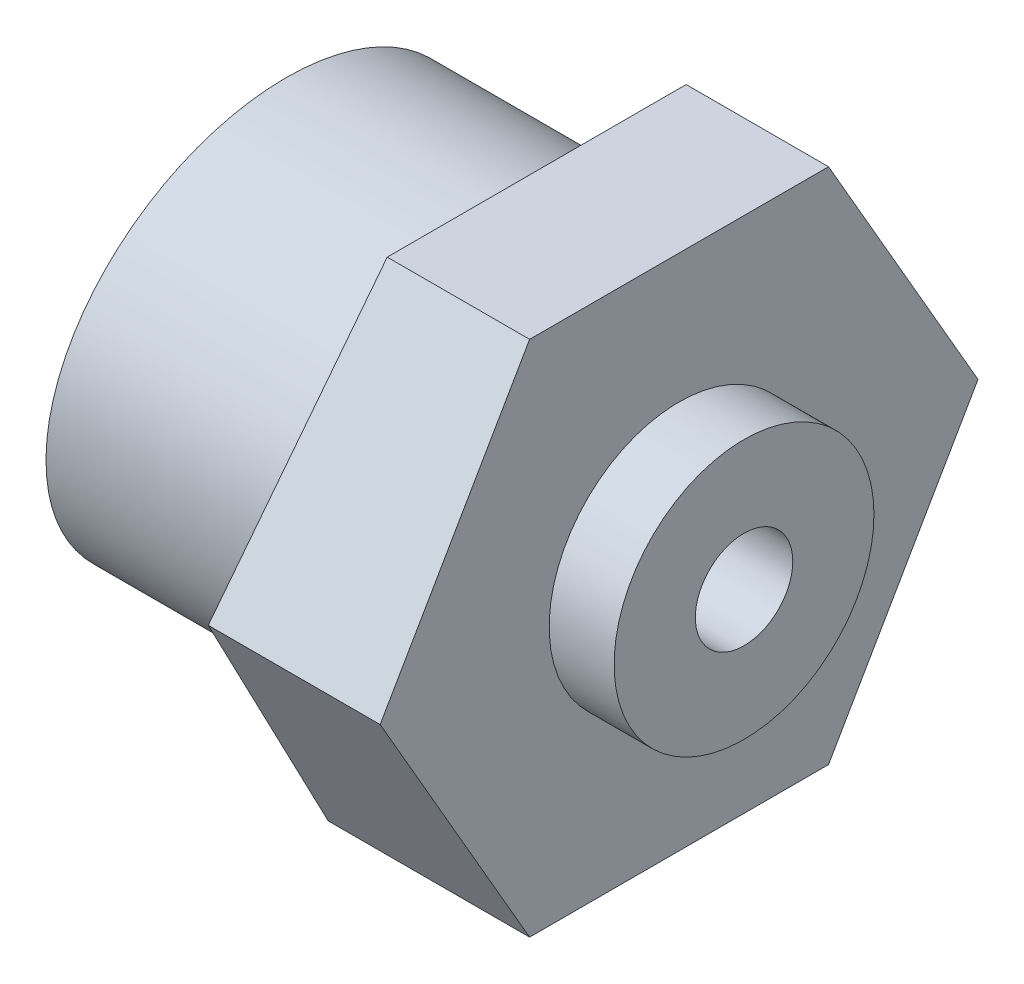
ISO-10303-21;
HEADER;
FILE_DESCRIPTION(('STEP AP214'),'2;1');
FILE_NAME('part.step','',(''),(''),'','','');
FILE_SCHEMA(('AUTOMOTIVE_DESIGN { 1 0 10303 214 1 1 1 1 }'));
ENDSEC;
DATA;
#1=APPLICATION_CONTEXT('core data for automotive mechanical design processes');
#2=APPLICATION_PROTOCOL_DEFINITION('international standard','automotive_design',2000,#1);
#3=PRODUCT_CONTEXT('',#1,'mechanical');
#4=PRODUCT('Part','Part','',(#3));
#5=PRODUCT_RELATED_PRODUCT_CATEGORY('part','',(#4));
#6=PRODUCT_DEFINITION_FORMATION('','',#4);
#7=PRODUCT_DEFINITION_CONTEXT('part definition',#1,'design');
#8=PRODUCT_DEFINITION('design','',#6,#7);
#9=PRODUCT_DEFINITION_SHAPE('','',#8);
#10=(LENGTH_UNIT() NAMED_UNIT(*) SI_UNIT(.MILLI.,.METRE.));
#11=(NAMED_UNIT(*) PLANE_ANGLE_UNIT() SI_UNIT($,.RADIAN.));
#12=(NAMED_UNIT(*) SI_UNIT($,.STERADIAN.) SOLID_ANGLE_UNIT());
#13=UNCERTAINTY_MEASURE_WITH_UNIT(LENGTH_MEASURE(1.E-05),#10,'distance_accuracy_value','');
#14=(GEOMETRIC_REPRESENTATION_CONTEXT(3) GLOBAL_UNCERTAINTY_ASSIGNED_CONTEXT((#13)) GLOBAL_UNIT_ASSIGNED_CONTEXT((#10,
#11,#12)) REPRESENTATION_CONTEXT('',''));
#15=CARTESIAN_POINT('',(0.,0.,0.));
#16=DIRECTION('',(0.,0.,1.));
#17=DIRECTION('',(1.,0.,0.));
#18=AXIS2_PLACEMENT_3D('',#15,#16,#17);
#19=CARTESIAN_POINT('',(-3.1,3.98499999999998,2.30074082272071));
#20=DIRECTION('',(0.,0.499999999999995,0.866025403784441));
#21=DIRECTION('',(0.,-0.866025403784441,0.499999999999995));
#22=AXIS2_PLACEMENT_3D('',#19,#20,#21);
#23=PLANE('',#22);
#24=DIRECTION('',(0.0981942796621983,0.861840131684073,-0.497583632026216));
#25=VECTOR('',#24,1.);
#26=CARTESIAN_POINT('',(-2.20068888774655,3.9081523310297,2.34510884508729));
#27=LINE('',#26,#25);
#28=CARTESIAN_POINT('',(-2.64596660091793,0.,4.60148164544132));
#29=VERTEX_POINT('',#28);
#30=CARTESIAN_POINT('',(-2.19193320183586,3.98499999999998,2.30074082272071));
#31=VERTEX_POINT('',#30);
#32=EDGE_CURVE('E124',#29,#31,#27,.T.);
#33=ORIENTED_EDGE('',*,*,#32,.F.);
#34=DIRECTION('',(1.,0.,0.));
#35=VECTOR('',#34,1.);
#36=CARTESIAN_POINT('',(-3.1,0.,4.60148164544132));
#37=LINE('',#36,#35);
#38=CARTESIAN_POINT('',(0.,0.,4.60148164544132));
#39=VERTEX_POINT('',#38);
#40=EDGE_CURVE('E108',#29,#39,#37,.T.);
#41=ORIENTED_EDGE('',*,*,#40,.T.);
#42=DIRECTION('',(0.,-0.866025403784441,0.499999999999995));
#43=VECTOR('',#42,1.);
#44=CARTESIAN_POINT('',(0.,3.98499999999998,2.30074082272071));
#45=LINE('',#44,#43);
#46=CARTESIAN_POINT('',(0.,3.98499999999998,2.30074082272071));
#47=VERTEX_POINT('',#46);
#48=EDGE_CURVE('E121',#47,#39,#45,.T.);
#49=ORIENTED_EDGE('',*,*,#48,.F.);
#50=DIRECTION('',(1.,0.,0.));
#51=VECTOR('',#50,1.);
#52=CARTESIAN_POINT('',(-3.1,3.98499999999998,2.30074082272071));
#53=LINE('',#52,#51);
#54=EDGE_CURVE('E48',#31,#47,#53,.T.);
#55=ORIENTED_EDGE('',*,*,#54,.F.);
#56=EDGE_LOOP('',(#33,#41,#49,#55));
#57=FACE_BOUND('',#56,.T.);
#58=ADVANCED_FACE('F39',(#57),#23,.T.);
#59=CARTESIAN_POINT('',(-3.1,3.98500000000002,-2.30074082272062));
#60=DIRECTION('',(0.,1.,0.));
#61=DIRECTION('',(0.,0.,1.));
#62=AXIS2_PLACEMENT_3D('',#59,#60,#61);
#63=PLANE('',#62);
#64=DIRECTION('',(0.,0.,1.));
#65=VECTOR('',#64,1.);
#66=CARTESIAN_POINT('',(-2.19193320183586,3.98499999999998,-16.5));
#67=LINE('',#66,#65);
#68=CARTESIAN_POINT('',(-2.19193320183586,3.98499999999997,-2.30074082272065));
#69=VERTEX_POINT('',#68);
#70=EDGE_CURVE('E150',#69,#31,#67,.T.);
#71=ORIENTED_EDGE('',*,*,#70,.T.);
#72=ORIENTED_EDGE('',*,*,#54,.T.);
#73=DIRECTION('',(0.,0.,1.));
#74=VECTOR('',#73,1.);
#75=CARTESIAN_POINT('',(0.,3.98500000000002,-2.30074082272062));
#76=LINE('',#75,#74);
#77=CARTESIAN_POINT('',(0.,3.98500000000002,-2.30074082272062));
#78=VERTEX_POINT('',#77);
#79=EDGE_CURVE('E97',#78,#47,#76,.T.);
#80=ORIENTED_EDGE('',*,*,#79,.F.);
#81=DIRECTION('',(1.,0.,0.));
#82=VECTOR('',#81,1.);
#83=CARTESIAN_POINT('',(-3.1,3.98500000000002,-2.30074082272062));
#84=LINE('',#83,#82);
#85=EDGE_CURVE('E80',#69,#78,#84,.T.);
#86=ORIENTED_EDGE('',*,*,#85,.F.);
#87=EDGE_LOOP('',(#71,#72,#80,#86));
#88=FACE_BOUND('',#87,.T.);
#89=ADVANCED_FACE('F102',(#88),#63,.T.);
#90=CARTESIAN_POINT('',(-3.1,0.,-4.60148164544132));
#91=DIRECTION('',(0.,0.500000000000007,-0.866025403784435));
#92=DIRECTION('',(0.,0.866025403784435,0.500000000000007));
#93=AXIS2_PLACEMENT_3D('',#90,#91,#92);
#94=PLANE('',#93);
#95=DIRECTION('',(-0.0981942796621976,-0.861840131684067,-0.497583632026228));
#96=VECTOR('',#95,1.);
#97=CARTESIAN_POINT('',(-2.65034444387327,-0.0384238344851046,-4.62366565662461));
#98=LINE('',#97,#96);
#99=CARTESIAN_POINT('',(-2.64596660091792,0.,-4.60148164544132));
#100=VERTEX_POINT('',#99);
#101=EDGE_CURVE('E87',#69,#100,#98,.T.);
#102=ORIENTED_EDGE('',*,*,#101,.F.);
#103=ORIENTED_EDGE('',*,*,#85,.T.);
#104=DIRECTION('',(0.,0.866025403784435,0.500000000000007));
#105=VECTOR('',#104,1.);
#106=CARTESIAN_POINT('',(0.,0.,-4.60148164544132));
#107=LINE('',#106,#105);
#108=CARTESIAN_POINT('',(0.,0.,-4.60148164544132));
#109=VERTEX_POINT('',#108);
#110=EDGE_CURVE('E84',#109,#78,#107,.T.);
#111=ORIENTED_EDGE('',*,*,#110,.F.);
#112=DIRECTION('',(1.,0.,0.));
#113=VECTOR('',#112,1.);
#114=CARTESIAN_POINT('',(-3.1,0.,-4.60148164544132));
#115=LINE('',#114,#113);
#116=EDGE_CURVE('E91',#100,#109,#115,.T.);
#117=ORIENTED_EDGE('',*,*,#116,.F.);
#118=EDGE_LOOP('',(#102,#103,#111,#117));
#119=FACE_BOUND('',#118,.T.);
#120=ADVANCED_FACE('F82',(#119),#94,.T.);
#121=CARTESIAN_POINT('',(-3.1,-3.98499999999999,-2.30074082272068));
#122=DIRECTION('',(0.,-0.499999999999995,-0.866025403784441));
#123=DIRECTION('',(0.,0.866025403784441,-0.499999999999995));
#124=AXIS2_PLACEMENT_3D('',#121,#122,#123);
#125=PLANE('',#124);
#126=DIRECTION('',(-0.0981942796621984,-0.861840131684074,0.497583632026216));
#127=VECTOR('',#126,1.);
#128=CARTESIAN_POINT('',(-3.1,-3.98499999999999,-2.30074082272068));
#129=LINE('',#128,#127);
#130=CARTESIAN_POINT('',(-3.1,-3.98499999999999,-2.30074082272068));
#131=VERTEX_POINT('',#130);
#132=EDGE_CURVE('E56',#100,#131,#129,.T.);
#133=ORIENTED_EDGE('',*,*,#132,.F.);
#134=ORIENTED_EDGE('',*,*,#116,.T.);
#135=DIRECTION('',(0.,0.866025403784441,-0.499999999999995));
#136=VECTOR('',#135,1.);
#137=CARTESIAN_POINT('',(0.,-3.98499999999999,-2.30074082272068));
#138=LINE('',#137,#136);
#139=CARTESIAN_POINT('',(0.,-3.98499999999999,-2.30074082272068));
#140=VERTEX_POINT('',#139);
#141=EDGE_CURVE('E100',#140,#109,#138,.T.);
#142=ORIENTED_EDGE('',*,*,#141,.F.);
#143=DIRECTION('',(1.,0.,0.));
#144=VECTOR('',#143,1.);
#145=CARTESIAN_POINT('',(-3.1,-3.98499999999999,-2.30074082272068));
#146=LINE('',#145,#144);
#147=EDGE_CURVE('E114',#131,#140,#146,.T.);
#148=ORIENTED_EDGE('',*,*,#147,.F.);
#149=EDGE_LOOP('',(#133,#134,#142,#148));
#150=FACE_BOUND('',#149,.T.);
#151=ADVANCED_FACE('F141',(#150),#125,.T.);
#152=CARTESIAN_POINT('',(-3.1,-3.98500000000001,2.30074082272065));
#153=DIRECTION('',(0.,-1.,0.));
#154=DIRECTION('',(0.,0.,-1.));
#155=AXIS2_PLACEMENT_3D('',#152,#153,#154);
#156=PLANE('',#155);
#157=DIRECTION('',(0.,0.,-1.));
#158=VECTOR('',#157,1.);
#159=CARTESIAN_POINT('',(0.,-3.98500000000001,2.30074082272065));
#160=LINE('',#159,#158);
#161=CARTESIAN_POINT('',(0.,-3.98500000000001,2.30074082272065));
#162=VERTEX_POINT('',#161);
#163=EDGE_CURVE('E132',#162,#140,#160,.T.);
#164=ORIENTED_EDGE('',*,*,#163,.F.);
#165=DIRECTION('',(1.,0.,0.));
#166=VECTOR('',#165,1.);
#167=CARTESIAN_POINT('',(-3.1,-3.98500000000001,2.30074082272065));
#168=LINE('',#167,#166);
#169=CARTESIAN_POINT('',(-3.1,-3.98500000000001,2.30074082272065));
#170=VERTEX_POINT('',#169);
#171=EDGE_CURVE('E116',#170,#162,#168,.T.);
#172=ORIENTED_EDGE('',*,*,#171,.F.);
#173=DIRECTION('',(0.,0.,-1.));
#174=VECTOR('',#173,1.);
#175=CARTESIAN_POINT('',(-3.1,-3.98500000000001,2.30074082272065));
#176=LINE('',#175,#174);
#177=EDGE_CURVE('E105',#170,#131,#176,.T.);
#178=ORIENTED_EDGE('',*,*,#177,.T.);
#179=ORIENTED_EDGE('',*,*,#147,.T.);
#180=EDGE_LOOP('',(#164,#172,#178,#179));
#181=FACE_BOUND('',#180,.T.);
#182=ADVANCED_FACE('F138',(#181),#156,.T.);
#183=CARTESIAN_POINT('',(-3.1,0.,4.60148164544132));
#184=DIRECTION('',(0.,-0.500000000000001,0.866025403784438));
#185=DIRECTION('',(0.,-0.866025403784438,-0.500000000000001));
#186=AXIS2_PLACEMENT_3D('',#183,#184,#185);
#187=PLANE('',#186);
#188=DIRECTION('',(0.098194279662198,0.86184013168407,0.497583632026222));
#189=VECTOR('',#188,1.);
#190=CARTESIAN_POINT('',(-2.65034444387327,-0.0384238344851357,4.57929763425803));
#191=LINE('',#190,#189);
#192=EDGE_CURVE('E145',#170,#29,#191,.T.);
#193=ORIENTED_EDGE('',*,*,#192,.F.);
#194=ORIENTED_EDGE('',*,*,#171,.T.);
#195=DIRECTION('',(0.,-0.866025403784438,-0.500000000000001));
#196=VECTOR('',#195,1.);
#197=CARTESIAN_POINT('',(0.,0.,4.60148164544132));
#198=LINE('',#197,#196);
#199=EDGE_CURVE('E128',#39,#162,#198,.T.);
#200=ORIENTED_EDGE('',*,*,#199,.F.);
#201=ORIENTED_EDGE('',*,*,#40,.F.);
#202=EDGE_LOOP('',(#193,#194,#200,#201));
#203=FACE_BOUND('',#202,.T.);
#204=ADVANCED_FACE('F129',(#203),#187,.T.);
#205=CARTESIAN_POINT('',(0.,0.,0.));
#206=DIRECTION('',(1.,0.,0.));
#207=DIRECTION('',(0.,0.,-1.));
#208=AXIS2_PLACEMENT_3D('',#205,#206,#207);
#209=PLANE('',#208);
#210=CARTESIAN_POINT('',(0.,0.,0.));
#211=DIRECTION('',(1.,0.,0.));
#212=DIRECTION('',(0.,0.,-1.));
#213=AXIS2_PLACEMENT_3D('',#210,#211,#212);
#214=CIRCLE('',#213,2.);
#215=CARTESIAN_POINT('',(0.,0.,-2.));
#216=VERTEX_POINT('',#215);
#217=EDGE_CURVE('E11',#216,#216,#214,.T.);
#218=ORIENTED_EDGE('',*,*,#217,.F.);
#219=EDGE_LOOP('',(#218));
#220=FACE_BOUND('',#219,.T.);
#221=ORIENTED_EDGE('',*,*,#48,.T.);
#222=ORIENTED_EDGE('',*,*,#199,.T.);
#223=ORIENTED_EDGE('',*,*,#163,.T.);
#224=ORIENTED_EDGE('',*,*,#141,.T.);
#225=ORIENTED_EDGE('',*,*,#110,.T.);
#226=ORIENTED_EDGE('',*,*,#79,.T.);
#227=EDGE_LOOP('',(#221,#222,#223,#224,#225,#226));
#228=FACE_BOUND('',#227,.T.);
#229=ADVANCED_FACE('F96',(#220,#228),#209,.T.);
#230=CARTESIAN_POINT('',(-3.1,-3.98500000000001,-16.5));
#231=DIRECTION('',(0.993571855676587,-0.11320321376791,0.));
#232=DIRECTION('',(0.11320321376791,0.993571855676587,0.));
#233=AXIS2_PLACEMENT_3D('',#230,#231,#232);
#234=PLANE('',#233);
#235=CARTESIAN_POINT('',(-2.64596660091793,0.,0.));
#236=DIRECTION('',(0.993571855676587,-0.11320321376791,0.));
#237=DIRECTION('',(0.11320321376791,0.993571855676587,0.));
#238=AXIS2_PLACEMENT_3D('',#235,#236,#237);
#239=ELLIPSE('',#238,3.32135011790649,3.3);
#240=CARTESIAN_POINT('',(-2.26997909352248,3.3,0.));
#241=VERTEX_POINT('',#240);
#242=EDGE_CURVE('E42',#241,#241,#239,.T.);
#243=ORIENTED_EDGE('',*,*,#242,.T.);
#244=EDGE_LOOP('',(#243));
#245=FACE_BOUND('',#244,.T.);
#246=ORIENTED_EDGE('',*,*,#101,.T.);
#247=ORIENTED_EDGE('',*,*,#132,.T.);
#248=ORIENTED_EDGE('',*,*,#177,.F.);
#249=ORIENTED_EDGE('',*,*,#192,.T.);
#250=ORIENTED_EDGE('',*,*,#32,.T.);
#251=ORIENTED_EDGE('',*,*,#70,.F.);
#252=EDGE_LOOP('',(#246,#247,#248,#249,#250,#251));
#253=FACE_BOUND('',#252,.T.);
#254=ADVANCED_FACE('F149',(#245,#253),#234,.F.);
#255=CARTESIAN_POINT('',(-6.8,0.,0.));
#256=DIRECTION('',(1.,0.,0.));
#257=DIRECTION('',(0.,0.,-1.));
#258=AXIS2_PLACEMENT_3D('',#255,#256,#257);
#259=CYLINDRICAL_SURFACE('',#258,3.3);
#260=CARTESIAN_POINT('',(-6.42401249260456,0.,0.));
#261=DIRECTION('',(0.993571855676587,-0.11320321376791,0.));
#262=DIRECTION('',(0.11320321376791,0.993571855676587,0.));
#263=AXIS2_PLACEMENT_3D('',#260,#261,#262);
#264=ELLIPSE('',#263,3.32135011790649,3.3);
#265=CARTESIAN_POINT('',(-6.04802498520912,3.3,0.));
#266=VERTEX_POINT('',#265);
#267=EDGE_CURVE('E156',#266,#266,#264,.F.);
#268=ORIENTED_EDGE('',*,*,#267,.F.);
#269=EDGE_LOOP('',(#268));
#270=FACE_BOUND('',#269,.T.);
#271=ORIENTED_EDGE('',*,*,#242,.F.);
#272=EDGE_LOOP('',(#271));
#273=FACE_BOUND('',#272,.T.);
#274=ADVANCED_FACE('F191',(#270,#273),#259,.T.);
#275=CARTESIAN_POINT('',(-6.8,-3.3,-3.4));
#276=DIRECTION('',(0.993571855676587,-0.11320321376791,0.));
#277=DIRECTION('',(0.11320321376791,0.993571855676587,0.));
#278=AXIS2_PLACEMENT_3D('',#275,#276,#277);
#279=PLANE('',#278);
#280=CARTESIAN_POINT('',(-6.42401249260456,0.,0.));
#281=DIRECTION('',(0.993571855676587,-0.11320321376791,0.));
#282=DIRECTION('',(0.11320321376791,0.993571855676587,0.));
#283=AXIS2_PLACEMENT_3D('',#280,#281,#282);
#284=ELLIPSE('',#283,0.754852299524202,0.75);
#285=CARTESIAN_POINT('',(-6.33856078637832,0.75,0.));
#286=VERTEX_POINT('',#285);
#287=EDGE_CURVE('E162',#286,#286,#284,.T.);
#288=ORIENTED_EDGE('',*,*,#287,.T.);
#289=EDGE_LOOP('',(#288));
#290=FACE_BOUND('',#289,.T.);
#291=ORIENTED_EDGE('',*,*,#267,.T.);
#292=EDGE_LOOP('',(#291));
#293=FACE_BOUND('',#292,.T.);
#294=ADVANCED_FACE('F181',(#290,#293),#279,.F.);
#295=CARTESIAN_POINT('',(1.,0.,0.));
#296=DIRECTION('',(-1.,0.,0.));
#297=DIRECTION('',(0.,0.,1.));
#298=AXIS2_PLACEMENT_3D('',#295,#296,#297);
#299=CYLINDRICAL_SURFACE('',#298,2.);
#300=CARTESIAN_POINT('',(1.,0.,0.));
#301=DIRECTION('',(1.,0.,0.));
#302=DIRECTION('',(0.,0.,-1.));
#303=AXIS2_PLACEMENT_3D('',#300,#301,#302);
#304=CIRCLE('',#303,2.);
#305=CARTESIAN_POINT('',(1.,0.,-2.));
#306=VERTEX_POINT('',#305);
#307=EDGE_CURVE('E158',#306,#306,#304,.T.);
#308=ORIENTED_EDGE('',*,*,#307,.F.);
#309=EDGE_LOOP('',(#308));
#310=FACE_BOUND('',#309,.T.);
#311=ORIENTED_EDGE('',*,*,#217,.T.);
#312=EDGE_LOOP('',(#311));
#313=FACE_BOUND('',#312,.T.);
#314=ADVANCED_FACE('F175',(#310,#313),#299,.T.);
#315=CARTESIAN_POINT('',(1.,0.,0.));
#316=DIRECTION('',(1.,0.,0.));
#317=DIRECTION('',(0.,0.,-1.));
#318=AXIS2_PLACEMENT_3D('',#315,#316,#317);
#319=PLANE('',#318);
#320=CARTESIAN_POINT('',(1.,0.,0.));
#321=DIRECTION('',(1.,0.,0.));
#322=DIRECTION('',(0.,0.,-1.));
#323=AXIS2_PLACEMENT_3D('',#320,#321,#322);
#324=CIRCLE('',#323,0.75);
#325=CARTESIAN_POINT('',(1.,0.,-0.75));
#326=VERTEX_POINT('',#325);
#327=EDGE_CURVE('E165',#326,#326,#324,.T.);
#328=ORIENTED_EDGE('',*,*,#327,.F.);
#329=EDGE_LOOP('',(#328));
#330=FACE_BOUND('',#329,.T.);
#331=ORIENTED_EDGE('',*,*,#307,.T.);
#332=EDGE_LOOP('',(#331));
#333=FACE_BOUND('',#332,.T.);
#334=ADVANCED_FACE('F172',(#330,#333),#319,.T.);
#335=CARTESIAN_POINT('',(-6.8,0.,0.));
#336=DIRECTION('',(1.,0.,0.));
#337=DIRECTION('',(0.,0.,-1.));
#338=AXIS2_PLACEMENT_3D('',#335,#336,#337);
#339=CYLINDRICAL_SURFACE('',#338,0.75);
#340=ORIENTED_EDGE('',*,*,#327,.T.);
#341=EDGE_LOOP('',(#340));
#342=FACE_BOUND('',#341,.T.);
#343=ORIENTED_EDGE('',*,*,#287,.F.);
#344=EDGE_LOOP('',(#343));
#345=FACE_BOUND('',#344,.T.);
#346=ADVANCED_FACE('F169',(#342,#345),#339,.F.);
#347=CLOSED_SHELL('',(#58,#89,#120,#151,#182,#204,#229,#254,#274,#294,#314,#334,#346));
#348=MANIFOLD_SOLID_BREP('B2',#347);
#349=ADVANCED_BREP_SHAPE_REPRESENTATION('',(#18,#348),#14);
#350=SHAPE_DEFINITION_REPRESENTATION(#9,#349);
ENDSEC;
END-ISO-10303-21;
